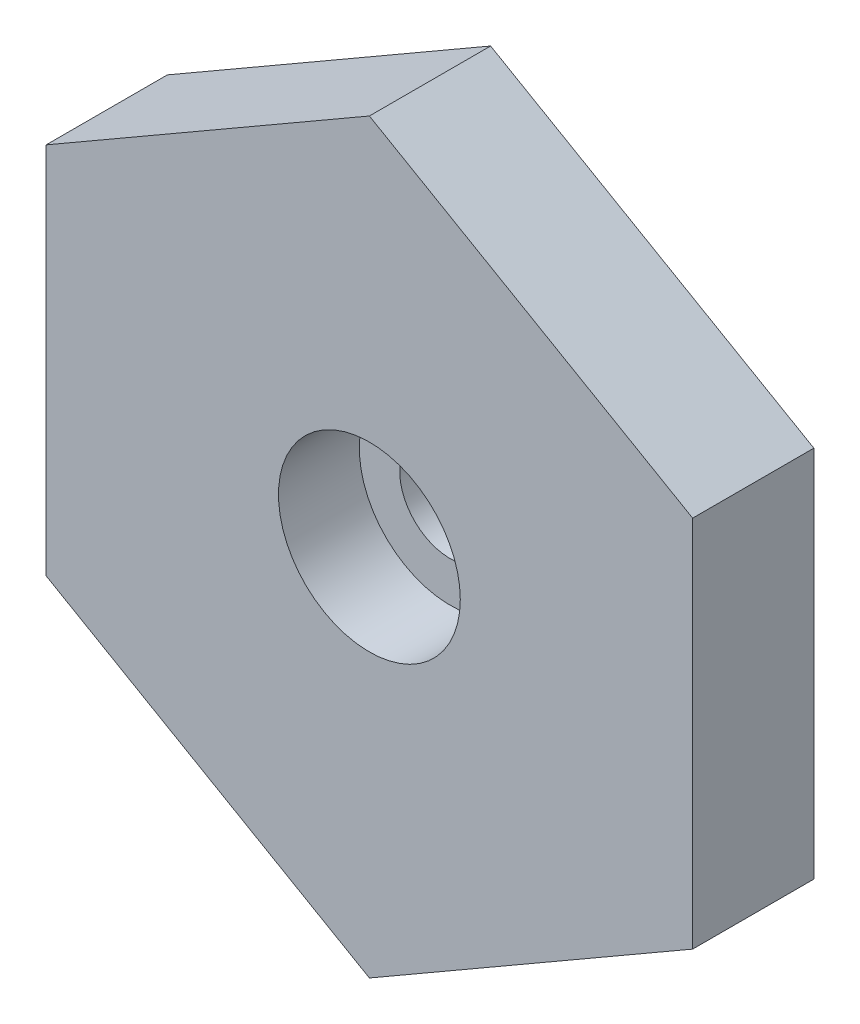
ISO-10303-21;
HEADER;
FILE_DESCRIPTION(('STEP AP214'),'2;1');
FILE_NAME('part.step','',(''),(''),'','','');
FILE_SCHEMA(('AUTOMOTIVE_DESIGN { 1 0 10303 214 1 1 1 1 }'));
ENDSEC;
DATA;
#1=APPLICATION_CONTEXT('core data for automotive mechanical design processes');
#2=APPLICATION_PROTOCOL_DEFINITION('international standard','automotive_design',2000,#1);
#3=PRODUCT_CONTEXT('',#1,'mechanical');
#4=PRODUCT('Part','Part','',(#3));
#5=PRODUCT_RELATED_PRODUCT_CATEGORY('part','',(#4));
#6=PRODUCT_DEFINITION_FORMATION('','',#4);
#7=PRODUCT_DEFINITION_CONTEXT('part definition',#1,'design');
#8=PRODUCT_DEFINITION('design','',#6,#7);
#9=PRODUCT_DEFINITION_SHAPE('','',#8);
#10=(LENGTH_UNIT() NAMED_UNIT(*) SI_UNIT(.MILLI.,.METRE.));
#11=(NAMED_UNIT(*) PLANE_ANGLE_UNIT() SI_UNIT($,.RADIAN.));
#12=(NAMED_UNIT(*) SI_UNIT($,.STERADIAN.) SOLID_ANGLE_UNIT());
#13=UNCERTAINTY_MEASURE_WITH_UNIT(LENGTH_MEASURE(1.E-05),#10,'distance_accuracy_value','');
#14=(GEOMETRIC_REPRESENTATION_CONTEXT(3) GLOBAL_UNCERTAINTY_ASSIGNED_CONTEXT((#13)) GLOBAL_UNIT_ASSIGNED_CONTEXT((#10,
#11,#12)) REPRESENTATION_CONTEXT('',''));
#15=CARTESIAN_POINT('',(0.,0.,0.));
#16=DIRECTION('',(0.,0.,1.));
#17=DIRECTION('',(1.,0.,0.));
#18=AXIS2_PLACEMENT_3D('',#15,#16,#17);
#19=CARTESIAN_POINT('',(0.,0.,0.));
#20=DIRECTION('',(0.,0.,1.));
#21=DIRECTION('',(1.,0.,0.));
#22=AXIS2_PLACEMENT_3D('',#19,#20,#21);
#23=PLANE('',#22);
#24=CARTESIAN_POINT('',(0.,0.,0.));
#25=DIRECTION('',(0.,0.,1.));
#26=DIRECTION('',(1.,0.,0.));
#27=AXIS2_PLACEMENT_3D('',#24,#25,#26);
#28=CIRCLE('',#27,2.5);
#29=CARTESIAN_POINT('',(2.5,0.,0.));
#30=VERTEX_POINT('',#29);
#31=EDGE_CURVE('E138',#30,#30,#28,.T.);
#32=ORIENTED_EDGE('',*,*,#31,.T.);
#33=EDGE_LOOP('',(#32));
#34=FACE_BOUND('',#33,.T.);
#35=CARTESIAN_POINT('',(0.,0.,0.));
#36=DIRECTION('',(0.,0.,-1.));
#37=DIRECTION('',(-1.,0.,0.));
#38=AXIS2_PLACEMENT_3D('',#35,#36,#37);
#39=CIRCLE('',#38,8.);
#40=CARTESIAN_POINT('',(-8.,0.,0.));
#41=VERTEX_POINT('',#40);
#42=EDGE_CURVE('E223',#41,#41,#39,.T.);
#43=ORIENTED_EDGE('',*,*,#42,.T.);
#44=EDGE_LOOP('',(#43));
#45=FACE_BOUND('',#44,.T.);
#46=ADVANCED_FACE('F36',(#34,#45),#23,.F.);
#47=CARTESIAN_POINT('',(0.,0.,6.));
#48=DIRECTION('',(0.,0.,-1.));
#49=DIRECTION('',(-1.,0.,0.));
#50=AXIS2_PLACEMENT_3D('',#47,#48,#49);
#51=CYLINDRICAL_SURFACE('',#50,2.5);
#52=ORIENTED_EDGE('',*,*,#31,.F.);
#53=EDGE_LOOP('',(#52));
#54=FACE_BOUND('',#53,.T.);
#55=CARTESIAN_POINT('',(0.,0.,2.));
#56=DIRECTION('',(0.,0.,1.));
#57=DIRECTION('',(1.,0.,0.));
#58=AXIS2_PLACEMENT_3D('',#55,#56,#57);
#59=CIRCLE('',#58,2.5);
#60=CARTESIAN_POINT('',(2.5,0.,2.));
#61=VERTEX_POINT('',#60);
#62=EDGE_CURVE('E40',#61,#61,#59,.T.);
#63=ORIENTED_EDGE('',*,*,#62,.T.);
#64=EDGE_LOOP('',(#63));
#65=FACE_BOUND('',#64,.T.);
#66=ADVANCED_FACE('F291',(#54,#65),#51,.F.);
#67=CARTESIAN_POINT('',(0.,0.,6.));
#68=DIRECTION('',(0.,0.,1.));
#69=DIRECTION('',(1.,0.,0.));
#70=AXIS2_PLACEMENT_3D('',#67,#68,#69);
#71=PLANE('',#70);
#72=CARTESIAN_POINT('',(0.,0.,6.));
#73=DIRECTION('',(0.,0.,1.));
#74=DIRECTION('',(1.,0.,0.));
#75=AXIS2_PLACEMENT_3D('',#72,#73,#74);
#76=CIRCLE('',#75,4.5);
#77=CARTESIAN_POINT('',(4.5,0.,6.));
#78=VERTEX_POINT('',#77);
#79=EDGE_CURVE('E166',#78,#78,#76,.T.);
#80=ORIENTED_EDGE('',*,*,#79,.F.);
#81=EDGE_LOOP('',(#80));
#82=FACE_BOUND('',#81,.T.);
#83=DIRECTION('',(0.,1.,0.));
#84=VECTOR('',#83,1.);
#85=CARTESIAN_POINT('',(16.,-9.23760430703401,6.));
#86=LINE('',#85,#84);
#87=CARTESIAN_POINT('',(16.,-9.23760430703401,6.));
#88=VERTEX_POINT('',#87);
#89=CARTESIAN_POINT('',(16.,9.23760430703399,6.));
#90=VERTEX_POINT('',#89);
#91=EDGE_CURVE('E146',#88,#90,#86,.T.);
#92=ORIENTED_EDGE('',*,*,#91,.T.);
#93=DIRECTION('',(-0.866025403784438,0.5,0.));
#94=VECTOR('',#93,1.);
#95=CARTESIAN_POINT('',(16.,9.23760430703399,6.));
#96=LINE('',#95,#94);
#97=CARTESIAN_POINT('',(0.,18.475208614068,6.));
#98=VERTEX_POINT('',#97);
#99=EDGE_CURVE('E96',#90,#98,#96,.T.);
#100=ORIENTED_EDGE('',*,*,#99,.T.);
#101=DIRECTION('',(-0.866025403784439,-0.5,0.));
#102=VECTOR('',#101,1.);
#103=CARTESIAN_POINT('',(0.,18.475208614068,6.));
#104=LINE('',#103,#102);
#105=CARTESIAN_POINT('',(-16.,9.23760430703401,6.));
#106=VERTEX_POINT('',#105);
#107=EDGE_CURVE('E113',#98,#106,#104,.T.);
#108=ORIENTED_EDGE('',*,*,#107,.T.);
#109=DIRECTION('',(0.,-1.,0.));
#110=VECTOR('',#109,1.);
#111=CARTESIAN_POINT('',(-16.,9.23760430703401,6.));
#112=LINE('',#111,#110);
#113=CARTESIAN_POINT('',(-16.,-9.23760430703399,6.));
#114=VERTEX_POINT('',#113);
#115=EDGE_CURVE('E106',#106,#114,#112,.T.);
#116=ORIENTED_EDGE('',*,*,#115,.T.);
#117=DIRECTION('',(0.866025403784439,-0.5,0.));
#118=VECTOR('',#117,1.);
#119=CARTESIAN_POINT('',(-16.,-9.23760430703399,6.));
#120=LINE('',#119,#118);
#121=CARTESIAN_POINT('',(0.,-18.475208614068,6.));
#122=VERTEX_POINT('',#121);
#123=EDGE_CURVE('E110',#114,#122,#120,.T.);
#124=ORIENTED_EDGE('',*,*,#123,.T.);
#125=DIRECTION('',(0.866025403784439,0.5,0.));
#126=VECTOR('',#125,1.);
#127=CARTESIAN_POINT('',(0.,-18.475208614068,6.));
#128=LINE('',#127,#126);
#129=EDGE_CURVE('E61',#122,#88,#128,.T.);
#130=ORIENTED_EDGE('',*,*,#129,.T.);
#131=EDGE_LOOP('',(#92,#100,#108,#116,#124,#130));
#132=FACE_BOUND('',#131,.T.);
#133=ADVANCED_FACE('F108',(#82,#132),#71,.T.);
#134=DIRECTION('',(0.5,0.866025403784439,0.));
#135=VECTOR('',#134,1.);
#136=CARTESIAN_POINT('',(-13.971876514389,0.,0.));
#137=LINE('',#136,#135);
#138=CARTESIAN_POINT('',(-13.971876514389,0.,0.));
#139=VERTEX_POINT('',#138);
#140=CARTESIAN_POINT('',(-6.98593825719448,12.1,0.));
#141=VERTEX_POINT('',#140);
#142=EDGE_CURVE('E202',#139,#141,#137,.T.);
#143=ORIENTED_EDGE('',*,*,#142,.F.);
#144=DIRECTION('',(-0.5,0.866025403784439,0.));
#145=VECTOR('',#144,1.);
#146=CARTESIAN_POINT('',(-6.98593825719447,-12.1,0.));
#147=LINE('',#146,#145);
#148=CARTESIAN_POINT('',(-6.98593825719447,-12.1,0.));
#149=VERTEX_POINT('',#148);
#150=EDGE_CURVE('E52',#149,#139,#147,.T.);
#151=ORIENTED_EDGE('',*,*,#150,.F.);
#152=DIRECTION('',(-1.,0.,0.));
#153=VECTOR('',#152,1.);
#154=CARTESIAN_POINT('',(6.98593825719447,-12.1,0.));
#155=LINE('',#154,#153);
#156=CARTESIAN_POINT('',(6.98593825719447,-12.1,0.));
#157=VERTEX_POINT('',#156);
#158=EDGE_CURVE('E189',#157,#149,#155,.T.);
#159=ORIENTED_EDGE('',*,*,#158,.F.);
#160=DIRECTION('',(-0.5,-0.866025403784439,0.));
#161=VECTOR('',#160,1.);
#162=CARTESIAN_POINT('',(13.971876514389,0.,0.));
#163=LINE('',#162,#161);
#164=CARTESIAN_POINT('',(13.971876514389,0.,0.));
#165=VERTEX_POINT('',#164);
#166=EDGE_CURVE('E193',#165,#157,#163,.T.);
#167=ORIENTED_EDGE('',*,*,#166,.F.);
#168=DIRECTION('',(0.5,-0.866025403784439,0.));
#169=VECTOR('',#168,1.);
#170=CARTESIAN_POINT('',(6.98593825719448,12.1,0.));
#171=LINE('',#170,#169);
#172=CARTESIAN_POINT('',(6.98593825719448,12.1,0.));
#173=VERTEX_POINT('',#172);
#174=EDGE_CURVE('E196',#173,#165,#171,.T.);
#175=ORIENTED_EDGE('',*,*,#174,.F.);
#176=DIRECTION('',(1.,0.,0.));
#177=VECTOR('',#176,1.);
#178=CARTESIAN_POINT('',(-6.98593825719448,12.1,0.));
#179=LINE('',#178,#177);
#180=EDGE_CURVE('E199',#141,#173,#179,.T.);
#181=ORIENTED_EDGE('',*,*,#180,.F.);
#182=EDGE_LOOP('',(#143,#151,#159,#167,#175,#181));
#183=FACE_BOUND('',#182,.T.);
#184=DIRECTION('',(0.,1.,0.));
#185=VECTOR('',#184,1.);
#186=CARTESIAN_POINT('',(16.,-9.23760430703401,0.));
#187=LINE('',#186,#185);
#188=CARTESIAN_POINT('',(16.,-9.23760430703401,0.));
#189=VERTEX_POINT('',#188);
#190=CARTESIAN_POINT('',(16.,9.23760430703399,0.));
#191=VERTEX_POINT('',#190);
#192=EDGE_CURVE('E134',#189,#191,#187,.T.);
#193=ORIENTED_EDGE('',*,*,#192,.F.);
#194=DIRECTION('',(0.866025403784439,0.5,0.));
#195=VECTOR('',#194,1.);
#196=CARTESIAN_POINT('',(0.,-18.475208614068,0.));
#197=LINE('',#196,#195);
#198=CARTESIAN_POINT('',(0.,-18.475208614068,0.));
#199=VERTEX_POINT('',#198);
#200=EDGE_CURVE('E88',#199,#189,#197,.T.);
#201=ORIENTED_EDGE('',*,*,#200,.F.);
#202=DIRECTION('',(0.866025403784439,-0.5,0.));
#203=VECTOR('',#202,1.);
#204=CARTESIAN_POINT('',(-16.,-9.23760430703399,0.));
#205=LINE('',#204,#203);
#206=CARTESIAN_POINT('',(-16.,-9.23760430703399,0.));
#207=VERTEX_POINT('',#206);
#208=EDGE_CURVE('E143',#207,#199,#205,.T.);
#209=ORIENTED_EDGE('',*,*,#208,.F.);
#210=DIRECTION('',(0.,-1.,0.));
#211=VECTOR('',#210,1.);
#212=CARTESIAN_POINT('',(-16.,9.23760430703401,0.));
#213=LINE('',#212,#211);
#214=CARTESIAN_POINT('',(-16.,9.23760430703401,0.));
#215=VERTEX_POINT('',#214);
#216=EDGE_CURVE('E122',#215,#207,#213,.T.);
#217=ORIENTED_EDGE('',*,*,#216,.F.);
#218=DIRECTION('',(-0.866025403784439,-0.5,0.));
#219=VECTOR('',#218,1.);
#220=CARTESIAN_POINT('',(0.,18.475208614068,0.));
#221=LINE('',#220,#219);
#222=CARTESIAN_POINT('',(0.,18.475208614068,0.));
#223=VERTEX_POINT('',#222);
#224=EDGE_CURVE('E140',#223,#215,#221,.T.);
#225=ORIENTED_EDGE('',*,*,#224,.F.);
#226=DIRECTION('',(-0.866025403784438,0.5,0.));
#227=VECTOR('',#226,1.);
#228=CARTESIAN_POINT('',(16.,9.23760430703399,0.));
#229=LINE('',#228,#227);
#230=EDGE_CURVE('E137',#191,#223,#229,.T.);
#231=ORIENTED_EDGE('',*,*,#230,.F.);
#232=EDGE_LOOP('',(#193,#201,#209,#217,#225,#231));
#233=FACE_BOUND('',#232,.T.);
#234=ADVANCED_FACE('F156',(#183,#233),#23,.F.);
#235=CARTESIAN_POINT('',(16.,-9.23760430703401,6.));
#236=DIRECTION('',(-1.,0.,0.));
#237=DIRECTION('',(0.,-1.,0.));
#238=AXIS2_PLACEMENT_3D('',#235,#236,#237);
#239=PLANE('',#238);
#240=ORIENTED_EDGE('',*,*,#192,.T.);
#241=DIRECTION('',(0.,0.,-1.));
#242=VECTOR('',#241,1.);
#243=CARTESIAN_POINT('',(16.,9.23760430703399,6.));
#244=LINE('',#243,#242);
#245=EDGE_CURVE('E11',#90,#191,#244,.T.);
#246=ORIENTED_EDGE('',*,*,#245,.F.);
#247=ORIENTED_EDGE('',*,*,#91,.F.);
#248=DIRECTION('',(0.,0.,-1.));
#249=VECTOR('',#248,1.);
#250=CARTESIAN_POINT('',(16.,-9.23760430703401,6.));
#251=LINE('',#250,#249);
#252=EDGE_CURVE('E130',#88,#189,#251,.T.);
#253=ORIENTED_EDGE('',*,*,#252,.T.);
#254=EDGE_LOOP('',(#240,#246,#247,#253));
#255=FACE_BOUND('',#254,.T.);
#256=ADVANCED_FACE('F38',(#255),#239,.F.);
#257=CARTESIAN_POINT('',(16.,9.23760430703399,6.));
#258=DIRECTION('',(-0.5,-0.866025403784439,0.));
#259=DIRECTION('',(0.866025403784439,-0.5,0.));
#260=AXIS2_PLACEMENT_3D('',#257,#258,#259);
#261=PLANE('',#260);
#262=ORIENTED_EDGE('',*,*,#230,.T.);
#263=DIRECTION('',(0.,0.,-1.));
#264=VECTOR('',#263,1.);
#265=CARTESIAN_POINT('',(0.,18.475208614068,6.));
#266=LINE('',#265,#264);
#267=EDGE_CURVE('E45',#98,#223,#266,.T.);
#268=ORIENTED_EDGE('',*,*,#267,.F.);
#269=ORIENTED_EDGE('',*,*,#99,.F.);
#270=ORIENTED_EDGE('',*,*,#245,.T.);
#271=EDGE_LOOP('',(#262,#268,#269,#270));
#272=FACE_BOUND('',#271,.T.);
#273=ADVANCED_FACE('F307',(#272),#261,.F.);
#274=CARTESIAN_POINT('',(0.,18.475208614068,6.));
#275=DIRECTION('',(0.5,-0.866025403784439,0.));
#276=DIRECTION('',(0.866025403784439,0.5,0.));
#277=AXIS2_PLACEMENT_3D('',#274,#275,#276);
#278=PLANE('',#277);
#279=ORIENTED_EDGE('',*,*,#224,.T.);
#280=DIRECTION('',(0.,0.,-1.));
#281=VECTOR('',#280,1.);
#282=CARTESIAN_POINT('',(-16.,9.23760430703401,6.));
#283=LINE('',#282,#281);
#284=EDGE_CURVE('E125',#106,#215,#283,.T.);
#285=ORIENTED_EDGE('',*,*,#284,.F.);
#286=ORIENTED_EDGE('',*,*,#107,.F.);
#287=ORIENTED_EDGE('',*,*,#267,.T.);
#288=EDGE_LOOP('',(#279,#285,#286,#287));
#289=FACE_BOUND('',#288,.T.);
#290=ADVANCED_FACE('F153',(#289),#278,.F.);
#291=CARTESIAN_POINT('',(-16.,9.23760430703401,6.));
#292=DIRECTION('',(1.,0.,0.));
#293=DIRECTION('',(0.,1.,0.));
#294=AXIS2_PLACEMENT_3D('',#291,#292,#293);
#295=PLANE('',#294);
#296=ORIENTED_EDGE('',*,*,#216,.T.);
#297=DIRECTION('',(0.,0.,-1.));
#298=VECTOR('',#297,1.);
#299=CARTESIAN_POINT('',(-16.,-9.23760430703399,6.));
#300=LINE('',#299,#298);
#301=EDGE_CURVE('E119',#114,#207,#300,.T.);
#302=ORIENTED_EDGE('',*,*,#301,.F.);
#303=ORIENTED_EDGE('',*,*,#115,.F.);
#304=ORIENTED_EDGE('',*,*,#284,.T.);
#305=EDGE_LOOP('',(#296,#302,#303,#304));
#306=FACE_BOUND('',#305,.T.);
#307=ADVANCED_FACE('F120',(#306),#295,.F.);
#308=CARTESIAN_POINT('',(-16.,-9.23760430703399,6.));
#309=DIRECTION('',(0.5,0.866025403784439,0.));
#310=DIRECTION('',(-0.866025403784439,0.5,0.));
#311=AXIS2_PLACEMENT_3D('',#308,#309,#310);
#312=PLANE('',#311);
#313=ORIENTED_EDGE('',*,*,#208,.T.);
#314=DIRECTION('',(0.,0.,-1.));
#315=VECTOR('',#314,1.);
#316=CARTESIAN_POINT('',(0.,-18.475208614068,6.));
#317=LINE('',#316,#315);
#318=EDGE_CURVE('E126',#122,#199,#317,.T.);
#319=ORIENTED_EDGE('',*,*,#318,.F.);
#320=ORIENTED_EDGE('',*,*,#123,.F.);
#321=ORIENTED_EDGE('',*,*,#301,.T.);
#322=EDGE_LOOP('',(#313,#319,#320,#321));
#323=FACE_BOUND('',#322,.T.);
#324=ADVANCED_FACE('F128',(#323),#312,.F.);
#325=CARTESIAN_POINT('',(0.,-18.475208614068,6.));
#326=DIRECTION('',(-0.5,0.866025403784439,0.));
#327=DIRECTION('',(-0.866025403784439,-0.5,0.));
#328=AXIS2_PLACEMENT_3D('',#325,#326,#327);
#329=PLANE('',#328);
#330=ORIENTED_EDGE('',*,*,#200,.T.);
#331=ORIENTED_EDGE('',*,*,#252,.F.);
#332=ORIENTED_EDGE('',*,*,#129,.F.);
#333=ORIENTED_EDGE('',*,*,#318,.T.);
#334=EDGE_LOOP('',(#330,#331,#332,#333));
#335=FACE_BOUND('',#334,.T.);
#336=ADVANCED_FACE('F157',(#335),#329,.F.);
#337=CARTESIAN_POINT('',(0.,0.,2.));
#338=DIRECTION('',(0.,0.,1.));
#339=DIRECTION('',(1.,0.,0.));
#340=AXIS2_PLACEMENT_3D('',#337,#338,#339);
#341=CYLINDRICAL_SURFACE('',#340,4.5);
#342=CARTESIAN_POINT('',(0.,0.,2.));
#343=DIRECTION('',(0.,0.,1.));
#344=DIRECTION('',(1.,0.,0.));
#345=AXIS2_PLACEMENT_3D('',#342,#343,#344);
#346=CIRCLE('',#345,4.5);
#347=CARTESIAN_POINT('',(4.5,0.,2.));
#348=VERTEX_POINT('',#347);
#349=EDGE_CURVE('E169',#348,#348,#346,.T.);
#350=ORIENTED_EDGE('',*,*,#349,.F.);
#351=EDGE_LOOP('',(#350));
#352=FACE_BOUND('',#351,.T.);
#353=ORIENTED_EDGE('',*,*,#79,.T.);
#354=EDGE_LOOP('',(#353));
#355=FACE_BOUND('',#354,.T.);
#356=ADVANCED_FACE('F313',(#352,#355),#341,.F.);
#357=CARTESIAN_POINT('',(0.,0.,2.));
#358=DIRECTION('',(0.,0.,1.));
#359=DIRECTION('',(1.,0.,0.));
#360=AXIS2_PLACEMENT_3D('',#357,#358,#359);
#361=PLANE('',#360);
#362=ORIENTED_EDGE('',*,*,#62,.F.);
#363=EDGE_LOOP('',(#362));
#364=FACE_BOUND('',#363,.T.);
#365=ORIENTED_EDGE('',*,*,#349,.T.);
#366=EDGE_LOOP('',(#365));
#367=FACE_BOUND('',#366,.T.);
#368=ADVANCED_FACE('F316',(#364,#367),#361,.T.);
#369=CARTESIAN_POINT('',(-6.98593825719447,-12.1,4.));
#370=DIRECTION('',(-0.866025403784439,-0.5,0.));
#371=DIRECTION('',(0.5,-0.866025403784439,0.));
#372=AXIS2_PLACEMENT_3D('',#369,#370,#371);
#373=PLANE('',#372);
#374=ORIENTED_EDGE('',*,*,#150,.T.);
#375=DIRECTION('',(0.,0.,-1.));
#376=VECTOR('',#375,1.);
#377=CARTESIAN_POINT('',(-13.971876514389,0.,4.));
#378=LINE('',#377,#376);
#379=CARTESIAN_POINT('',(-13.971876514389,0.,4.));
#380=VERTEX_POINT('',#379);
#381=EDGE_CURVE('E173',#380,#139,#378,.T.);
#382=ORIENTED_EDGE('',*,*,#381,.F.);
#383=DIRECTION('',(-0.5,0.866025403784439,0.));
#384=VECTOR('',#383,1.);
#385=CARTESIAN_POINT('',(-6.98593825719447,-12.1,4.));
#386=LINE('',#385,#384);
#387=CARTESIAN_POINT('',(-6.98593825719447,-12.1,4.));
#388=VERTEX_POINT('',#387);
#389=EDGE_CURVE('E192',#388,#380,#386,.T.);
#390=ORIENTED_EDGE('',*,*,#389,.F.);
#391=DIRECTION('',(0.,0.,-1.));
#392=VECTOR('',#391,1.);
#393=CARTESIAN_POINT('',(-6.98593825719447,-12.1,4.));
#394=LINE('',#393,#392);
#395=EDGE_CURVE('E170',#388,#149,#394,.T.);
#396=ORIENTED_EDGE('',*,*,#395,.T.);
#397=EDGE_LOOP('',(#374,#382,#390,#396));
#398=FACE_BOUND('',#397,.T.);
#399=ADVANCED_FACE('F243',(#398),#373,.F.);
#400=CARTESIAN_POINT('',(6.98593825719447,-12.1,4.));
#401=DIRECTION('',(0.,-1.,0.));
#402=DIRECTION('',(0.,0.,-1.));
#403=AXIS2_PLACEMENT_3D('',#400,#401,#402);
#404=PLANE('',#403);
#405=ORIENTED_EDGE('',*,*,#158,.T.);
#406=ORIENTED_EDGE('',*,*,#395,.F.);
#407=DIRECTION('',(-1.,0.,0.));
#408=VECTOR('',#407,1.);
#409=CARTESIAN_POINT('',(6.98593825719447,-12.1,4.));
#410=LINE('',#409,#408);
#411=CARTESIAN_POINT('',(6.98593825719447,-12.1,4.));
#412=VERTEX_POINT('',#411);
#413=EDGE_CURVE('E176',#412,#388,#410,.T.);
#414=ORIENTED_EDGE('',*,*,#413,.F.);
#415=DIRECTION('',(0.,0.,-1.));
#416=VECTOR('',#415,1.);
#417=CARTESIAN_POINT('',(6.98593825719447,-12.1,4.));
#418=LINE('',#417,#416);
#419=EDGE_CURVE('E185',#412,#157,#418,.T.);
#420=ORIENTED_EDGE('',*,*,#419,.T.);
#421=EDGE_LOOP('',(#405,#406,#414,#420));
#422=FACE_BOUND('',#421,.T.);
#423=ADVANCED_FACE('F259',(#422),#404,.F.);
#424=CARTESIAN_POINT('',(13.971876514389,0.,4.));
#425=DIRECTION('',(0.866025403784439,-0.5,0.));
#426=DIRECTION('',(0.5,0.866025403784439,0.));
#427=AXIS2_PLACEMENT_3D('',#424,#425,#426);
#428=PLANE('',#427);
#429=ORIENTED_EDGE('',*,*,#166,.T.);
#430=ORIENTED_EDGE('',*,*,#419,.F.);
#431=DIRECTION('',(-0.5,-0.866025403784439,0.));
#432=VECTOR('',#431,1.);
#433=CARTESIAN_POINT('',(13.971876514389,0.,4.));
#434=LINE('',#433,#432);
#435=CARTESIAN_POINT('',(13.971876514389,0.,4.));
#436=VERTEX_POINT('',#435);
#437=EDGE_CURVE('E209',#436,#412,#434,.T.);
#438=ORIENTED_EDGE('',*,*,#437,.F.);
#439=DIRECTION('',(0.,0.,-1.));
#440=VECTOR('',#439,1.);
#441=CARTESIAN_POINT('',(13.971876514389,0.,4.));
#442=LINE('',#441,#440);
#443=EDGE_CURVE('E182',#436,#165,#442,.T.);
#444=ORIENTED_EDGE('',*,*,#443,.T.);
#445=EDGE_LOOP('',(#429,#430,#438,#444));
#446=FACE_BOUND('',#445,.T.);
#447=ADVANCED_FACE('F264',(#446),#428,.F.);
#448=CARTESIAN_POINT('',(6.98593825719448,12.1,4.));
#449=DIRECTION('',(0.866025403784439,0.5,0.));
#450=DIRECTION('',(-0.5,0.866025403784439,0.));
#451=AXIS2_PLACEMENT_3D('',#448,#449,#450);
#452=PLANE('',#451);
#453=ORIENTED_EDGE('',*,*,#174,.T.);
#454=ORIENTED_EDGE('',*,*,#443,.F.);
#455=DIRECTION('',(0.5,-0.866025403784439,0.));
#456=VECTOR('',#455,1.);
#457=CARTESIAN_POINT('',(6.98593825719448,12.1,4.));
#458=LINE('',#457,#456);
#459=CARTESIAN_POINT('',(6.98593825719448,12.1,4.));
#460=VERTEX_POINT('',#459);
#461=EDGE_CURVE('E212',#460,#436,#458,.T.);
#462=ORIENTED_EDGE('',*,*,#461,.F.);
#463=DIRECTION('',(0.,0.,-1.));
#464=VECTOR('',#463,1.);
#465=CARTESIAN_POINT('',(6.98593825719448,12.1,4.));
#466=LINE('',#465,#464);
#467=EDGE_CURVE('E179',#460,#173,#466,.T.);
#468=ORIENTED_EDGE('',*,*,#467,.T.);
#469=EDGE_LOOP('',(#453,#454,#462,#468));
#470=FACE_BOUND('',#469,.T.);
#471=ADVANCED_FACE('F281',(#470),#452,.F.);
#472=CARTESIAN_POINT('',(-6.98593825719448,12.1,4.));
#473=DIRECTION('',(0.,1.,0.));
#474=DIRECTION('',(-1.,0.,0.));
#475=AXIS2_PLACEMENT_3D('',#472,#473,#474);
#476=PLANE('',#475);
#477=ORIENTED_EDGE('',*,*,#180,.T.);
#478=ORIENTED_EDGE('',*,*,#467,.F.);
#479=DIRECTION('',(1.,0.,0.));
#480=VECTOR('',#479,1.);
#481=CARTESIAN_POINT('',(-6.98593825719448,12.1,4.));
#482=LINE('',#481,#480);
#483=CARTESIAN_POINT('',(-6.98593825719448,12.1,4.));
#484=VERTEX_POINT('',#483);
#485=EDGE_CURVE('E215',#484,#460,#482,.T.);
#486=ORIENTED_EDGE('',*,*,#485,.F.);
#487=DIRECTION('',(0.,0.,-1.));
#488=VECTOR('',#487,1.);
#489=CARTESIAN_POINT('',(-6.98593825719448,12.1,4.));
#490=LINE('',#489,#488);
#491=EDGE_CURVE('E175',#484,#141,#490,.T.);
#492=ORIENTED_EDGE('',*,*,#491,.T.);
#493=EDGE_LOOP('',(#477,#478,#486,#492));
#494=FACE_BOUND('',#493,.T.);
#495=ADVANCED_FACE('F277',(#494),#476,.F.);
#496=CARTESIAN_POINT('',(-13.971876514389,0.,4.));
#497=DIRECTION('',(-0.866025403784439,0.5,0.));
#498=DIRECTION('',(-0.5,-0.866025403784439,0.));
#499=AXIS2_PLACEMENT_3D('',#496,#497,#498);
#500=PLANE('',#499);
#501=ORIENTED_EDGE('',*,*,#142,.T.);
#502=ORIENTED_EDGE('',*,*,#491,.F.);
#503=DIRECTION('',(0.5,0.866025403784439,0.));
#504=VECTOR('',#503,1.);
#505=CARTESIAN_POINT('',(-13.971876514389,0.,4.));
#506=LINE('',#505,#504);
#507=EDGE_CURVE('E218',#380,#484,#506,.T.);
#508=ORIENTED_EDGE('',*,*,#507,.F.);
#509=ORIENTED_EDGE('',*,*,#381,.T.);
#510=EDGE_LOOP('',(#501,#502,#508,#509));
#511=FACE_BOUND('',#510,.T.);
#512=ADVANCED_FACE('F235',(#511),#500,.F.);
#513=CARTESIAN_POINT('',(0.,0.,4.));
#514=DIRECTION('',(0.,0.,-1.));
#515=DIRECTION('',(-1.,0.,0.));
#516=AXIS2_PLACEMENT_3D('',#513,#514,#515);
#517=PLANE('',#516);
#518=CARTESIAN_POINT('',(0.,0.,4.));
#519=DIRECTION('',(0.,0.,-1.));
#520=DIRECTION('',(-1.,0.,0.));
#521=AXIS2_PLACEMENT_3D('',#518,#519,#520);
#522=CIRCLE('',#521,8.);
#523=CARTESIAN_POINT('',(-8.,0.,4.));
#524=VERTEX_POINT('',#523);
#525=EDGE_CURVE('E206',#524,#524,#522,.T.);
#526=ORIENTED_EDGE('',*,*,#525,.F.);
#527=EDGE_LOOP('',(#526));
#528=FACE_BOUND('',#527,.T.);
#529=ORIENTED_EDGE('',*,*,#389,.T.);
#530=ORIENTED_EDGE('',*,*,#507,.T.);
#531=ORIENTED_EDGE('',*,*,#485,.T.);
#532=ORIENTED_EDGE('',*,*,#461,.T.);
#533=ORIENTED_EDGE('',*,*,#437,.T.);
#534=ORIENTED_EDGE('',*,*,#413,.T.);
#535=EDGE_LOOP('',(#529,#530,#531,#532,#533,#534));
#536=FACE_BOUND('',#535,.T.);
#537=ADVANCED_FACE('F232',(#528,#536),#517,.T.);
#538=CARTESIAN_POINT('',(0.,0.,4.));
#539=DIRECTION('',(0.,0.,-1.));
#540=DIRECTION('',(-1.,0.,0.));
#541=AXIS2_PLACEMENT_3D('',#538,#539,#540);
#542=CYLINDRICAL_SURFACE('',#541,8.);
#543=ORIENTED_EDGE('',*,*,#525,.T.);
#544=EDGE_LOOP('',(#543));
#545=FACE_BOUND('',#544,.T.);
#546=ORIENTED_EDGE('',*,*,#42,.F.);
#547=EDGE_LOOP('',(#546));
#548=FACE_BOUND('',#547,.T.);
#549=ADVANCED_FACE('F229',(#545,#548),#542,.T.);
#550=CLOSED_SHELL('',(#46,#66,#133,#234,#256,#273,#290,#307,#324,#336,#356,#368,#399,#423,#447,
#471,#495,#512,#537,#549));
#551=MANIFOLD_SOLID_BREP('B2',#550);
#552=ADVANCED_BREP_SHAPE_REPRESENTATION('',(#18,#551),#14);
#553=SHAPE_DEFINITION_REPRESENTATION(#9,#552);
ENDSEC;
END-ISO-10303-21;
